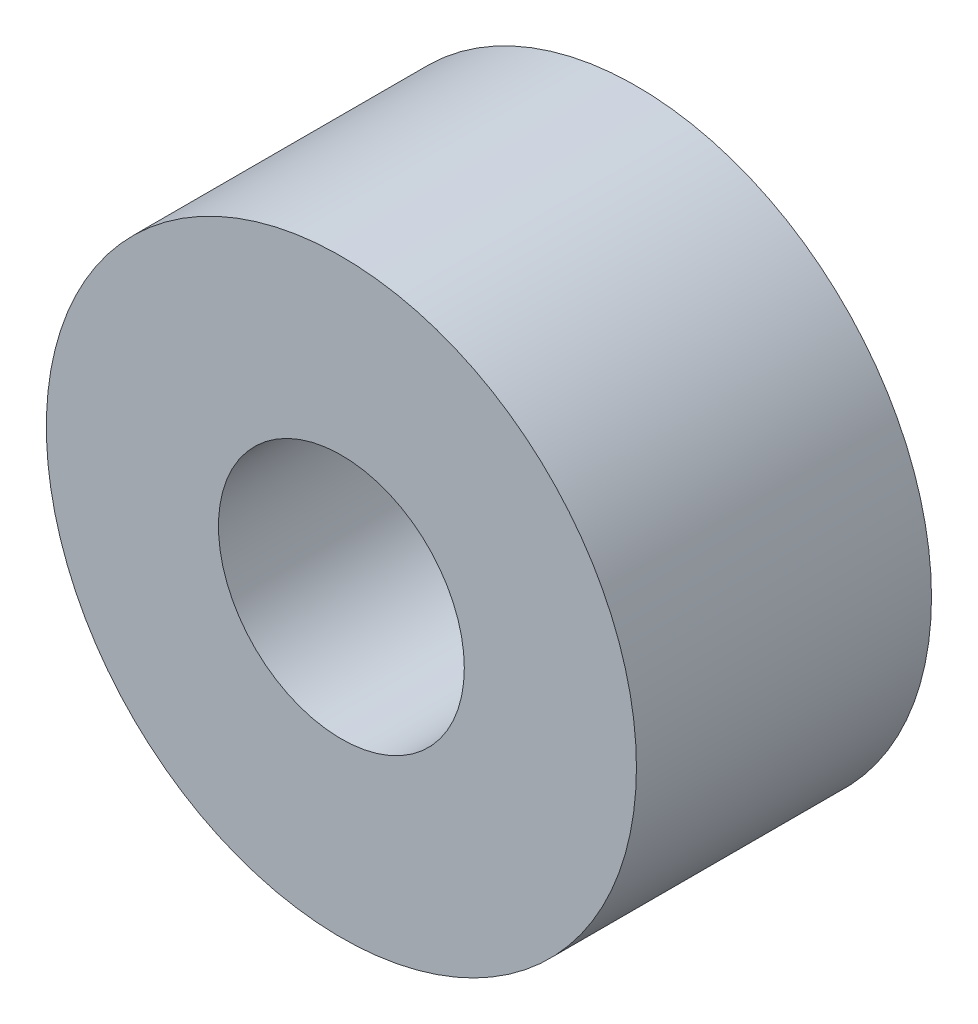
ISO-10303-21;
HEADER;
FILE_DESCRIPTION(('STEP AP214'),'2;1');
FILE_NAME('part.step','',(''),(''),'','','');
FILE_SCHEMA(('AUTOMOTIVE_DESIGN { 1 0 10303 214 1 1 1 1 }'));
ENDSEC;
DATA;
#1=APPLICATION_CONTEXT('core data for automotive mechanical design processes');
#2=APPLICATION_PROTOCOL_DEFINITION('international standard','automotive_design',2000,#1);
#3=PRODUCT_CONTEXT('',#1,'mechanical');
#4=PRODUCT('Part','Part','',(#3));
#5=PRODUCT_RELATED_PRODUCT_CATEGORY('part','',(#4));
#6=PRODUCT_DEFINITION_FORMATION('','',#4);
#7=PRODUCT_DEFINITION_CONTEXT('part definition',#1,'design');
#8=PRODUCT_DEFINITION('design','',#6,#7);
#9=PRODUCT_DEFINITION_SHAPE('','',#8);
#10=(LENGTH_UNIT() NAMED_UNIT(*) SI_UNIT(.MILLI.,.METRE.));
#11=(NAMED_UNIT(*) PLANE_ANGLE_UNIT() SI_UNIT($,.RADIAN.));
#12=(NAMED_UNIT(*) SI_UNIT($,.STERADIAN.) SOLID_ANGLE_UNIT());
#13=UNCERTAINTY_MEASURE_WITH_UNIT(LENGTH_MEASURE(1.E-05),#10,'distance_accuracy_value','');
#14=(GEOMETRIC_REPRESENTATION_CONTEXT(3) GLOBAL_UNCERTAINTY_ASSIGNED_CONTEXT((#13)) GLOBAL_UNIT_ASSIGNED_CONTEXT((#10,
#11,#12)) REPRESENTATION_CONTEXT('',''));
#15=CARTESIAN_POINT('',(0.,0.,0.));
#16=DIRECTION('',(0.,0.,1.));
#17=DIRECTION('',(1.,0.,0.));
#18=AXIS2_PLACEMENT_3D('',#15,#16,#17);
#19=CARTESIAN_POINT('',(0.,0.,3.));
#20=DIRECTION('',(0.,0.,1.));
#21=DIRECTION('',(1.,0.,0.));
#22=AXIS2_PLACEMENT_3D('',#19,#20,#21);
#23=PLANE('',#22);
#24=CARTESIAN_POINT('',(0.,0.,3.));
#25=DIRECTION('',(0.,0.,1.));
#26=DIRECTION('',(1.,0.,0.));
#27=AXIS2_PLACEMENT_3D('',#24,#25,#26);
#28=CIRCLE('',#27,3.);
#29=CARTESIAN_POINT('',(3.,0.,3.));
#30=VERTEX_POINT('',#29);
#31=EDGE_CURVE('E10',#30,#30,#28,.T.);
#32=ORIENTED_EDGE('',*,*,#31,.T.);
#33=EDGE_LOOP('',(#32));
#34=FACE_BOUND('',#33,.T.);
#35=CARTESIAN_POINT('',(0.,0.,3.));
#36=DIRECTION('',(0.,0.,1.));
#37=DIRECTION('',(1.,0.,0.));
#38=AXIS2_PLACEMENT_3D('',#35,#36,#37);
#39=CIRCLE('',#38,1.25);
#40=CARTESIAN_POINT('',(1.25,0.,3.));
#41=VERTEX_POINT('',#40);
#42=EDGE_CURVE('E50',#41,#41,#39,.T.);
#43=ORIENTED_EDGE('',*,*,#42,.F.);
#44=EDGE_LOOP('',(#43));
#45=FACE_BOUND('',#44,.T.);
#46=ADVANCED_FACE('F37',(#34,#45),#23,.T.);
#47=CARTESIAN_POINT('',(0.,0.,0.));
#48=DIRECTION('',(0.,0.,1.));
#49=DIRECTION('',(1.,0.,0.));
#50=AXIS2_PLACEMENT_3D('',#47,#48,#49);
#51=PLANE('',#50);
#52=CARTESIAN_POINT('',(0.,0.,0.));
#53=DIRECTION('',(0.,0.,1.));
#54=DIRECTION('',(1.,0.,0.));
#55=AXIS2_PLACEMENT_3D('',#52,#53,#54);
#56=CIRCLE('',#55,3.);
#57=CARTESIAN_POINT('',(3.,0.,0.));
#58=VERTEX_POINT('',#57);
#59=EDGE_CURVE('E41',#58,#58,#56,.T.);
#60=ORIENTED_EDGE('',*,*,#59,.F.);
#61=EDGE_LOOP('',(#60));
#62=FACE_BOUND('',#61,.T.);
#63=CARTESIAN_POINT('',(0.,0.,0.));
#64=DIRECTION('',(0.,0.,1.));
#65=DIRECTION('',(1.,0.,0.));
#66=AXIS2_PLACEMENT_3D('',#63,#64,#65);
#67=CIRCLE('',#66,1.25);
#68=CARTESIAN_POINT('',(1.25,0.,0.));
#69=VERTEX_POINT('',#68);
#70=EDGE_CURVE('E52',#69,#69,#67,.T.);
#71=ORIENTED_EDGE('',*,*,#70,.T.);
#72=EDGE_LOOP('',(#71));
#73=FACE_BOUND('',#72,.T.);
#74=ADVANCED_FACE('F64',(#62,#73),#51,.F.);
#75=CARTESIAN_POINT('',(0.,0.,3.));
#76=DIRECTION('',(0.,0.,-1.));
#77=DIRECTION('',(-1.,0.,0.));
#78=AXIS2_PLACEMENT_3D('',#75,#76,#77);
#79=CYLINDRICAL_SURFACE('',#78,3.);
#80=ORIENTED_EDGE('',*,*,#31,.F.);
#81=EDGE_LOOP('',(#80));
#82=FACE_BOUND('',#81,.T.);
#83=ORIENTED_EDGE('',*,*,#59,.T.);
#84=EDGE_LOOP('',(#83));
#85=FACE_BOUND('',#84,.T.);
#86=ADVANCED_FACE('F39',(#82,#85),#79,.T.);
#87=CARTESIAN_POINT('',(0.,0.,3.));
#88=DIRECTION('',(0.,0.,-1.));
#89=DIRECTION('',(-1.,0.,0.));
#90=AXIS2_PLACEMENT_3D('',#87,#88,#89);
#91=CYLINDRICAL_SURFACE('',#90,1.25);
#92=ORIENTED_EDGE('',*,*,#42,.T.);
#93=EDGE_LOOP('',(#92));
#94=FACE_BOUND('',#93,.T.);
#95=ORIENTED_EDGE('',*,*,#70,.F.);
#96=EDGE_LOOP('',(#95));
#97=FACE_BOUND('',#96,.T.);
#98=ADVANCED_FACE('F60',(#94,#97),#91,.F.);
#99=CLOSED_SHELL('',(#46,#74,#86,#98));
#100=MANIFOLD_SOLID_BREP('B2',#99);
#101=ADVANCED_BREP_SHAPE_REPRESENTATION('',(#18,#100),#14);
#102=SHAPE_DEFINITION_REPRESENTATION(#9,#101);
ENDSEC;
END-ISO-10303-21;
